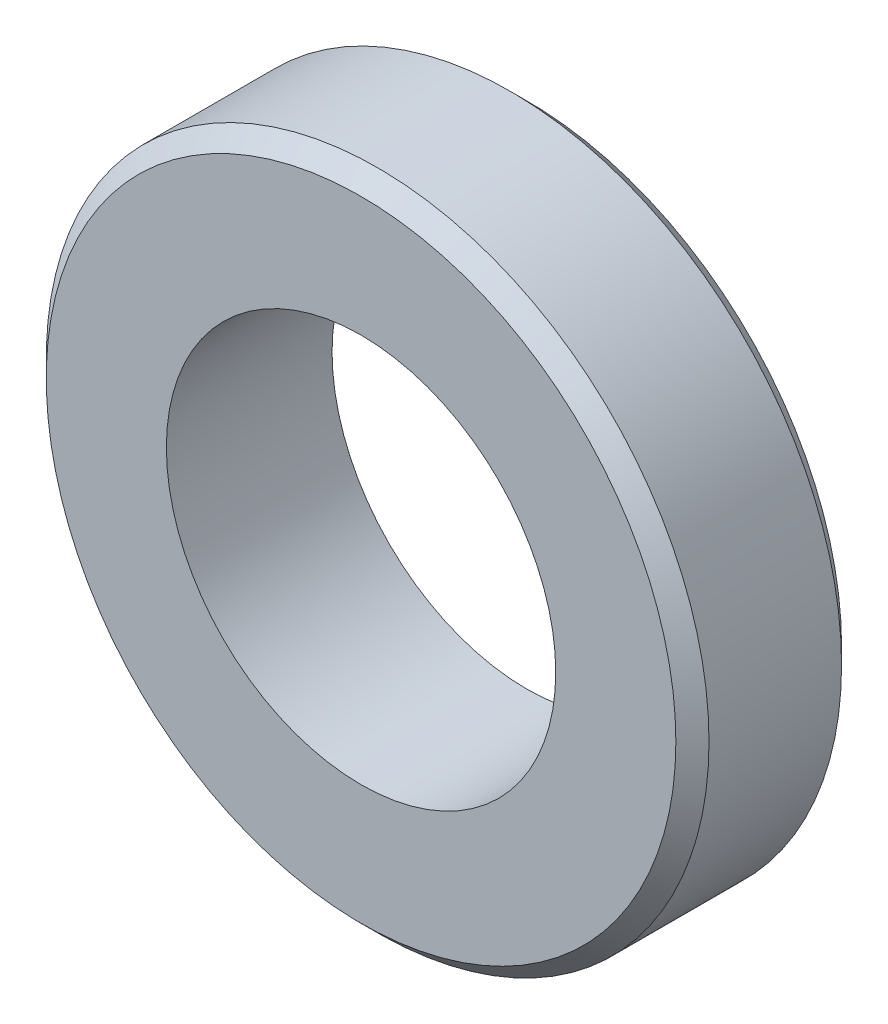
ISO-10303-21;
HEADER;
FILE_DESCRIPTION(('STEP AP214'),'2;1');
FILE_NAME('part.step','',(''),(''),'','','');
FILE_SCHEMA(('AUTOMOTIVE_DESIGN { 1 0 10303 214 1 1 1 1 }'));
ENDSEC;
DATA;
#1=APPLICATION_CONTEXT('core data for automotive mechanical design processes');
#2=APPLICATION_PROTOCOL_DEFINITION('international standard','automotive_design',2000,#1);
#3=PRODUCT_CONTEXT('',#1,'mechanical');
#4=PRODUCT('Part','Part','',(#3));
#5=PRODUCT_RELATED_PRODUCT_CATEGORY('part','',(#4));
#6=PRODUCT_DEFINITION_FORMATION('','',#4);
#7=PRODUCT_DEFINITION_CONTEXT('part definition',#1,'design');
#8=PRODUCT_DEFINITION('design','',#6,#7);
#9=PRODUCT_DEFINITION_SHAPE('','',#8);
#10=(LENGTH_UNIT() NAMED_UNIT(*) SI_UNIT(.MILLI.,.METRE.));
#11=(NAMED_UNIT(*) PLANE_ANGLE_UNIT() SI_UNIT($,.RADIAN.));
#12=(NAMED_UNIT(*) SI_UNIT($,.STERADIAN.) SOLID_ANGLE_UNIT());
#13=UNCERTAINTY_MEASURE_WITH_UNIT(LENGTH_MEASURE(1.E-05),#10,'distance_accuracy_value','');
#14=(GEOMETRIC_REPRESENTATION_CONTEXT(3) GLOBAL_UNCERTAINTY_ASSIGNED_CONTEXT((#13)) GLOBAL_UNIT_ASSIGNED_CONTEXT((#10,
#11,#12)) REPRESENTATION_CONTEXT('',''));
#15=CARTESIAN_POINT('',(0.,0.,0.));
#16=DIRECTION('',(0.,0.,1.));
#17=DIRECTION('',(1.,0.,0.));
#18=AXIS2_PLACEMENT_3D('',#15,#16,#17);
#19=CARTESIAN_POINT('',(0.,0.,20.));
#20=DIRECTION('',(0.,0.,1.));
#21=DIRECTION('',(1.,0.,0.));
#22=AXIS2_PLACEMENT_3D('',#19,#20,#21);
#23=PLANE('',#22);
#24=CARTESIAN_POINT('',(0.,0.,20.));
#25=DIRECTION('',(0.,0.,1.));
#26=DIRECTION('',(1.,0.,0.));
#27=AXIS2_PLACEMENT_3D('',#24,#25,#26);
#28=CIRCLE('',#27,38.);
#29=CARTESIAN_POINT('',(38.,0.,20.));
#30=VERTEX_POINT('',#29);
#31=EDGE_CURVE('E10',#30,#30,#28,.T.);
#32=ORIENTED_EDGE('',*,*,#31,.T.);
#33=EDGE_LOOP('',(#32));
#34=FACE_BOUND('',#33,.T.);
#35=CARTESIAN_POINT('',(0.,0.,20.));
#36=DIRECTION('',(0.,0.,1.));
#37=DIRECTION('',(1.,0.,0.));
#38=AXIS2_PLACEMENT_3D('',#35,#36,#37);
#39=CIRCLE('',#38,23.5);
#40=CARTESIAN_POINT('',(23.5,0.,20.));
#41=VERTEX_POINT('',#40);
#42=EDGE_CURVE('E51',#41,#41,#39,.T.);
#43=ORIENTED_EDGE('',*,*,#42,.F.);
#44=EDGE_LOOP('',(#43));
#45=FACE_BOUND('',#44,.T.);
#46=ADVANCED_FACE('F31',(#34,#45),#23,.T.);
#47=CARTESIAN_POINT('',(0.,0.,0.));
#48=DIRECTION('',(0.,0.,1.));
#49=DIRECTION('',(1.,0.,0.));
#50=AXIS2_PLACEMENT_3D('',#47,#48,#49);
#51=PLANE('',#50);
#52=CARTESIAN_POINT('',(0.,0.,0.));
#53=DIRECTION('',(0.,0.,1.));
#54=DIRECTION('',(1.,0.,0.));
#55=AXIS2_PLACEMENT_3D('',#52,#53,#54);
#56=CIRCLE('',#55,38.);
#57=CARTESIAN_POINT('',(38.,0.,0.));
#58=VERTEX_POINT('',#57);
#59=EDGE_CURVE('E38',#58,#58,#56,.F.);
#60=ORIENTED_EDGE('',*,*,#59,.T.);
#61=EDGE_LOOP('',(#60));
#62=FACE_BOUND('',#61,.T.);
#63=CARTESIAN_POINT('',(0.,0.,0.));
#64=DIRECTION('',(0.,0.,1.));
#65=DIRECTION('',(1.,0.,0.));
#66=AXIS2_PLACEMENT_3D('',#63,#64,#65);
#67=CIRCLE('',#66,23.5);
#68=CARTESIAN_POINT('',(23.5,0.,0.));
#69=VERTEX_POINT('',#68);
#70=EDGE_CURVE('E52',#69,#69,#67,.T.);
#71=ORIENTED_EDGE('',*,*,#70,.T.);
#72=EDGE_LOOP('',(#71));
#73=FACE_BOUND('',#72,.T.);
#74=ADVANCED_FACE('F62',(#62,#73),#51,.F.);
#75=CARTESIAN_POINT('',(0.,0.,20.));
#76=DIRECTION('',(0.,0.,-1.));
#77=DIRECTION('',(-1.,0.,0.));
#78=AXIS2_PLACEMENT_3D('',#75,#76,#77);
#79=CYLINDRICAL_SURFACE('',#78,40.);
#80=CARTESIAN_POINT('',(0.,0.,2.));
#81=DIRECTION('',(0.,0.,1.));
#82=DIRECTION('',(1.,0.,0.));
#83=AXIS2_PLACEMENT_3D('',#80,#81,#82);
#84=CIRCLE('',#83,40.);
#85=CARTESIAN_POINT('',(40.,0.,2.));
#86=VERTEX_POINT('',#85);
#87=EDGE_CURVE('E42',#86,#86,#84,.T.);
#88=ORIENTED_EDGE('',*,*,#87,.T.);
#89=EDGE_LOOP('',(#88));
#90=FACE_BOUND('',#89,.T.);
#91=CARTESIAN_POINT('',(0.,0.,18.));
#92=DIRECTION('',(0.,0.,1.));
#93=DIRECTION('',(1.,0.,0.));
#94=AXIS2_PLACEMENT_3D('',#91,#92,#93);
#95=CIRCLE('',#94,40.);
#96=CARTESIAN_POINT('',(40.,0.,18.));
#97=VERTEX_POINT('',#96);
#98=EDGE_CURVE('E46',#97,#97,#95,.F.);
#99=ORIENTED_EDGE('',*,*,#98,.T.);
#100=EDGE_LOOP('',(#99));
#101=FACE_BOUND('',#100,.T.);
#102=ADVANCED_FACE('F67',(#90,#101),#79,.T.);
#103=CARTESIAN_POINT('',(0.,0.,20.));
#104=DIRECTION('',(0.,0.,-1.));
#105=DIRECTION('',(-1.,0.,0.));
#106=AXIS2_PLACEMENT_3D('',#103,#104,#105);
#107=CYLINDRICAL_SURFACE('',#106,23.5);
#108=ORIENTED_EDGE('',*,*,#42,.T.);
#109=EDGE_LOOP('',(#108));
#110=FACE_BOUND('',#109,.T.);
#111=ORIENTED_EDGE('',*,*,#70,.F.);
#112=EDGE_LOOP('',(#111));
#113=FACE_BOUND('',#112,.T.);
#114=ADVANCED_FACE('F58',(#110,#113),#107,.F.);
#115=CARTESIAN_POINT('',(0.,0.,2.));
#116=DIRECTION('',(0.,0.,1.));
#117=DIRECTION('',(1.,0.,0.));
#118=AXIS2_PLACEMENT_3D('',#115,#116,#117);
#119=CONICAL_SURFACE('',#118,40.,0.785398163397452);
#120=ORIENTED_EDGE('',*,*,#59,.F.);
#121=EDGE_LOOP('',(#120));
#122=FACE_BOUND('',#121,.T.);
#123=ORIENTED_EDGE('',*,*,#87,.F.);
#124=EDGE_LOOP('',(#123));
#125=FACE_BOUND('',#124,.T.);
#126=ADVANCED_FACE('F73',(#122,#125),#119,.T.);
#127=CARTESIAN_POINT('',(0.,0.,20.));
#128=DIRECTION('',(0.,0.,-1.));
#129=DIRECTION('',(-1.,0.,0.));
#130=AXIS2_PLACEMENT_3D('',#127,#128,#129);
#131=CONICAL_SURFACE('',#130,38.,0.785398163397445);
#132=ORIENTED_EDGE('',*,*,#98,.F.);
#133=EDGE_LOOP('',(#132));
#134=FACE_BOUND('',#133,.T.);
#135=ORIENTED_EDGE('',*,*,#31,.F.);
#136=EDGE_LOOP('',(#135));
#137=FACE_BOUND('',#136,.T.);
#138=ADVANCED_FACE('F33',(#134,#137),#131,.T.);
#139=CLOSED_SHELL('',(#46,#74,#102,#114,#126,#138));
#140=MANIFOLD_SOLID_BREP('B2',#139);
#141=ADVANCED_BREP_SHAPE_REPRESENTATION('',(#18,#140),#14);
#142=SHAPE_DEFINITION_REPRESENTATION(#9,#141);
ENDSEC;
END-ISO-10303-21;
